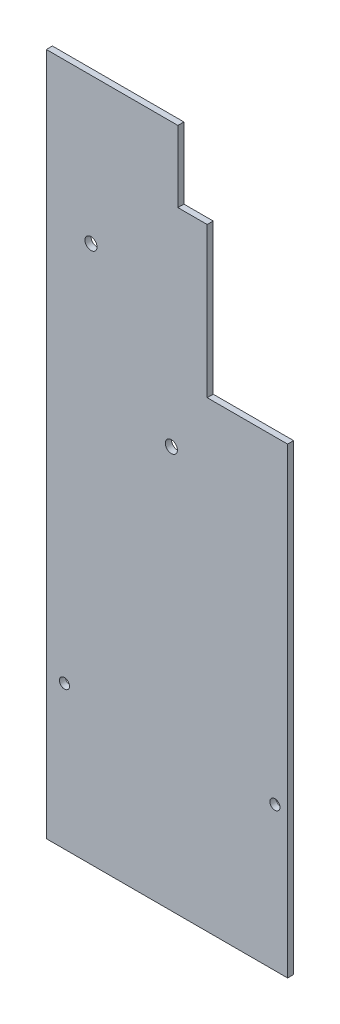
ISO-10303-21;
HEADER;
FILE_DESCRIPTION(('STEP AP214'),'2;1');
FILE_NAME('part.step','',(''),(''),'','','');
FILE_SCHEMA(('AUTOMOTIVE_DESIGN { 1 0 10303 214 1 1 1 1 }'));
ENDSEC;
DATA;
#1=APPLICATION_CONTEXT('core data for automotive mechanical design processes');
#2=APPLICATION_PROTOCOL_DEFINITION('international standard','automotive_design',2000,#1);
#3=PRODUCT_CONTEXT('',#1,'mechanical');
#4=PRODUCT('Part','Part','',(#3));
#5=PRODUCT_RELATED_PRODUCT_CATEGORY('part','',(#4));
#6=PRODUCT_DEFINITION_FORMATION('','',#4);
#7=PRODUCT_DEFINITION_CONTEXT('part definition',#1,'design');
#8=PRODUCT_DEFINITION('design','',#6,#7);
#9=PRODUCT_DEFINITION_SHAPE('','',#8);
#10=(LENGTH_UNIT() NAMED_UNIT(*) SI_UNIT(.MILLI.,.METRE.));
#11=(NAMED_UNIT(*) PLANE_ANGLE_UNIT() SI_UNIT($,.RADIAN.));
#12=(NAMED_UNIT(*) SI_UNIT($,.STERADIAN.) SOLID_ANGLE_UNIT());
#13=UNCERTAINTY_MEASURE_WITH_UNIT(LENGTH_MEASURE(1.E-05),#10,'distance_accuracy_value','');
#14=(GEOMETRIC_REPRESENTATION_CONTEXT(3) GLOBAL_UNCERTAINTY_ASSIGNED_CONTEXT((#13)) GLOBAL_UNIT_ASSIGNED_CONTEXT((#10,
#11,#12)) REPRESENTATION_CONTEXT('',''));
#15=CARTESIAN_POINT('',(0.,0.,0.));
#16=DIRECTION('',(0.,0.,1.));
#17=DIRECTION('',(1.,0.,0.));
#18=AXIS2_PLACEMENT_3D('',#15,#16,#17);
#19=CARTESIAN_POINT('',(20.0000000000001,-160.537558932388,23.901562241334));
#20=DIRECTION('',(-1.00000000000001,0.,0.));
#21=DIRECTION('',(0.,0.,1.00000000000001));
#22=AXIS2_PLACEMENT_3D('',#19,#20,#21);
#23=PLANE('',#22);
#24=DIRECTION('',(0.,-1.,0.));
#25=VECTOR('',#24,1.);
#26=CARTESIAN_POINT('',(20.0000000000001,-160.537558932388,25.401562241334));
#27=LINE('',#26,#25);
#28=CARTESIAN_POINT('',(20.0000000000001,-45.5375589323876,25.401562241334));
#29=VERTEX_POINT('',#28);
#30=CARTESIAN_POINT('',(20.0000000000001,-160.537558932388,25.401562241334));
#31=VERTEX_POINT('',#30);
#32=EDGE_CURVE('E125',#29,#31,#27,.T.);
#33=ORIENTED_EDGE('',*,*,#32,.T.);
#34=DIRECTION('',(0.,0.,1.00000000000001));
#35=VECTOR('',#34,1.);
#36=CARTESIAN_POINT('',(20.0000000000001,-160.537558932388,23.901562241334));
#37=LINE('',#36,#35);
#38=CARTESIAN_POINT('',(20.0000000000001,-160.537558932388,23.901562241334));
#39=VERTEX_POINT('',#38);
#40=EDGE_CURVE('E11',#39,#31,#37,.T.);
#41=ORIENTED_EDGE('',*,*,#40,.F.);
#42=DIRECTION('',(0.,-1.,0.));
#43=VECTOR('',#42,1.);
#44=CARTESIAN_POINT('',(20.0000000000001,-160.537558932388,23.901562241334));
#45=LINE('',#44,#43);
#46=CARTESIAN_POINT('',(20.0000000000003,-45.5375589323876,23.901562241334));
#47=VERTEX_POINT('',#46);
#48=EDGE_CURVE('E137',#47,#39,#45,.T.);
#49=ORIENTED_EDGE('',*,*,#48,.F.);
#50=DIRECTION('',(0.,0.,1.00000000000001));
#51=VECTOR('',#50,1.);
#52=CARTESIAN_POINT('',(20.0000000000003,-45.5375589323876,23.901562241334));
#53=LINE('',#52,#51);
#54=EDGE_CURVE('E124',#47,#29,#53,.T.);
#55=ORIENTED_EDGE('',*,*,#54,.T.);
#56=EDGE_LOOP('',(#33,#41,#49,#55));
#57=FACE_BOUND('',#56,.T.);
#58=ADVANCED_FACE('F32',(#57),#23,.F.);
#59=CARTESIAN_POINT('',(20.0000000000001,-160.537558932388,23.901562241334));
#60=DIRECTION('',(0.,1.,0.));
#61=DIRECTION('',(0.,0.,1.00000000000001));
#62=AXIS2_PLACEMENT_3D('',#59,#60,#61);
#63=PLANE('',#62);
#64=DIRECTION('',(-1.00000000000001,0.,0.));
#65=VECTOR('',#64,1.);
#66=CARTESIAN_POINT('',(20.0000000000001,-160.537558932388,25.401562241334));
#67=LINE('',#66,#65);
#68=CARTESIAN_POINT('',(-40.0000000000004,-160.537558932388,25.4015622413335));
#69=VERTEX_POINT('',#68);
#70=EDGE_CURVE('E128',#31,#69,#67,.T.);
#71=ORIENTED_EDGE('',*,*,#70,.T.);
#72=DIRECTION('',(0.,0.,1.00000000000001));
#73=VECTOR('',#72,1.);
#74=CARTESIAN_POINT('',(-40.0000000000003,-160.537558932388,23.9015622413335));
#75=LINE('',#74,#73);
#76=CARTESIAN_POINT('',(-40.0000000000003,-160.537558932388,23.9015622413335));
#77=VERTEX_POINT('',#76);
#78=EDGE_CURVE('E39',#77,#69,#75,.T.);
#79=ORIENTED_EDGE('',*,*,#78,.F.);
#80=DIRECTION('',(-1.00000000000001,0.,0.));
#81=VECTOR('',#80,1.);
#82=CARTESIAN_POINT('',(20.0000000000001,-160.537558932388,23.901562241334));
#83=LINE('',#82,#81);
#84=EDGE_CURVE('E87',#39,#77,#83,.T.);
#85=ORIENTED_EDGE('',*,*,#84,.F.);
#86=ORIENTED_EDGE('',*,*,#40,.T.);
#87=EDGE_LOOP('',(#71,#79,#85,#86));
#88=FACE_BOUND('',#87,.T.);
#89=ADVANCED_FACE('F183',(#88),#63,.F.);
#90=CARTESIAN_POINT('',(-40.0000000000003,-160.537558932388,23.9015622413335));
#91=DIRECTION('',(1.00000000000001,0.,0.));
#92=DIRECTION('',(0.,0.,-1.00000000000001));
#93=AXIS2_PLACEMENT_3D('',#90,#91,#92);
#94=PLANE('',#93);
#95=DIRECTION('',(0.,1.,0.));
#96=VECTOR('',#95,1.);
#97=CARTESIAN_POINT('',(-40.0000000000004,-160.537558932388,25.4015622413335));
#98=LINE('',#97,#96);
#99=CARTESIAN_POINT('',(-40.0000000000004,9.46244106761242,25.4015622413335));
#100=VERTEX_POINT('',#99);
#101=EDGE_CURVE('E109',#69,#100,#98,.T.);
#102=ORIENTED_EDGE('',*,*,#101,.T.);
#103=DIRECTION('',(0.,0.,1.00000000000001));
#104=VECTOR('',#103,1.);
#105=CARTESIAN_POINT('',(-40.0000000000003,9.46244106761242,23.9015622413335));
#106=LINE('',#105,#104);
#107=CARTESIAN_POINT('',(-40.0000000000003,9.46244106761242,23.9015622413335));
#108=VERTEX_POINT('',#107);
#109=EDGE_CURVE('E106',#108,#100,#106,.T.);
#110=ORIENTED_EDGE('',*,*,#109,.F.);
#111=DIRECTION('',(0.,1.,0.));
#112=VECTOR('',#111,1.);
#113=CARTESIAN_POINT('',(-40.0000000000003,-160.537558932388,23.9015622413335));
#114=LINE('',#113,#112);
#115=EDGE_CURVE('E94',#77,#108,#114,.T.);
#116=ORIENTED_EDGE('',*,*,#115,.F.);
#117=ORIENTED_EDGE('',*,*,#78,.T.);
#118=EDGE_LOOP('',(#102,#110,#116,#117));
#119=FACE_BOUND('',#118,.T.);
#120=ADVANCED_FACE('F107',(#119),#94,.F.);
#121=CARTESIAN_POINT('',(-40.0000000000003,9.46244106761242,23.9015622413335));
#122=DIRECTION('',(0.,-1.,0.));
#123=DIRECTION('',(1.00000000000001,0.,0.));
#124=AXIS2_PLACEMENT_3D('',#121,#122,#123);
#125=PLANE('',#124);
#126=DIRECTION('',(1.00000000000001,0.,0.));
#127=VECTOR('',#126,1.);
#128=CARTESIAN_POINT('',(-40.0000000000004,9.46244106761242,25.4015622413335));
#129=LINE('',#128,#127);
#130=CARTESIAN_POINT('',(-7.28976436130328,9.46244106761242,25.401562241334));
#131=VERTEX_POINT('',#130);
#132=EDGE_CURVE('E132',#100,#131,#129,.T.);
#133=ORIENTED_EDGE('',*,*,#132,.T.);
#134=DIRECTION('',(0.,0.,-1.00000000000001));
#135=VECTOR('',#134,1.);
#136=CARTESIAN_POINT('',(-7.28976436130328,9.46244106761242,25.402562241334));
#137=LINE('',#136,#135);
#138=CARTESIAN_POINT('',(-7.28976436130329,9.46244106761242,23.901562241334));
#139=VERTEX_POINT('',#138);
#140=EDGE_CURVE('E117',#131,#139,#137,.T.);
#141=ORIENTED_EDGE('',*,*,#140,.T.);
#142=DIRECTION('',(1.00000000000001,0.,0.));
#143=VECTOR('',#142,1.);
#144=CARTESIAN_POINT('',(-40.0000000000003,9.46244106761242,23.9015622413335));
#145=LINE('',#144,#143);
#146=EDGE_CURVE('E101',#108,#139,#145,.T.);
#147=ORIENTED_EDGE('',*,*,#146,.F.);
#148=ORIENTED_EDGE('',*,*,#109,.T.);
#149=EDGE_LOOP('',(#133,#141,#147,#148));
#150=FACE_BOUND('',#149,.T.);
#151=ADVANCED_FACE('F116',(#150),#125,.F.);
#152=CARTESIAN_POINT('',(0.,9.46244106761242,23.901562241334));
#153=DIRECTION('',(-1.00000000000001,0.,0.));
#154=DIRECTION('',(0.,-1.,0.));
#155=AXIS2_PLACEMENT_3D('',#152,#153,#154);
#156=PLANE('',#155);
#157=DIRECTION('',(0.,-1.,0.));
#158=VECTOR('',#157,1.);
#159=CARTESIAN_POINT('',(0.,9.46244106761242,23.901562241334));
#160=LINE('',#159,#158);
#161=CARTESIAN_POINT('',(0.,-8.23505770742372,23.901562241334));
#162=VERTEX_POINT('',#161);
#163=CARTESIAN_POINT('',(0.,-45.5375589323876,23.901562241334));
#164=VERTEX_POINT('',#163);
#165=EDGE_CURVE('E118',#162,#164,#160,.T.);
#166=ORIENTED_EDGE('',*,*,#165,.F.);
#167=DIRECTION('',(0.,0.,-1.00000000000001));
#168=VECTOR('',#167,1.);
#169=CARTESIAN_POINT('',(0.,-8.23505770742372,25.402562241334));
#170=LINE('',#169,#168);
#171=CARTESIAN_POINT('',(0.,-8.23505770742372,25.401562241334));
#172=VERTEX_POINT('',#171);
#173=EDGE_CURVE('E158',#172,#162,#170,.T.);
#174=ORIENTED_EDGE('',*,*,#173,.F.);
#175=DIRECTION('',(0.,-1.,0.));
#176=VECTOR('',#175,1.);
#177=CARTESIAN_POINT('',(0.,9.46244106761242,25.401562241334));
#178=LINE('',#177,#176);
#179=CARTESIAN_POINT('',(0.,-45.5375589323876,25.401562241334));
#180=VERTEX_POINT('',#179);
#181=EDGE_CURVE('E134',#172,#180,#178,.T.);
#182=ORIENTED_EDGE('',*,*,#181,.T.);
#183=DIRECTION('',(0.,0.,1.00000000000001));
#184=VECTOR('',#183,1.);
#185=CARTESIAN_POINT('',(0.,-45.5375589323876,23.901562241334));
#186=LINE('',#185,#184);
#187=EDGE_CURVE('E113',#164,#180,#186,.T.);
#188=ORIENTED_EDGE('',*,*,#187,.F.);
#189=EDGE_LOOP('',(#166,#174,#182,#188));
#190=FACE_BOUND('',#189,.T.);
#191=ADVANCED_FACE('F166',(#190),#156,.F.);
#192=CARTESIAN_POINT('',(0.,-45.5375589323876,23.901562241334));
#193=DIRECTION('',(0.,-1.,0.));
#194=DIRECTION('',(0.,0.,-1.00000000000001));
#195=AXIS2_PLACEMENT_3D('',#192,#193,#194);
#196=PLANE('',#195);
#197=DIRECTION('',(1.00000000000001,0.,0.));
#198=VECTOR('',#197,1.);
#199=CARTESIAN_POINT('',(0.,-45.5375589323876,25.401562241334));
#200=LINE('',#199,#198);
#201=EDGE_CURVE('E79',#180,#29,#200,.T.);
#202=ORIENTED_EDGE('',*,*,#201,.T.);
#203=ORIENTED_EDGE('',*,*,#54,.F.);
#204=DIRECTION('',(1.00000000000001,0.,0.));
#205=VECTOR('',#204,1.);
#206=CARTESIAN_POINT('',(0.,-45.5375589323876,23.901562241334));
#207=LINE('',#206,#205);
#208=EDGE_CURVE('E55',#164,#47,#207,.T.);
#209=ORIENTED_EDGE('',*,*,#208,.F.);
#210=ORIENTED_EDGE('',*,*,#187,.T.);
#211=EDGE_LOOP('',(#202,#203,#209,#210));
#212=FACE_BOUND('',#211,.T.);
#213=ADVANCED_FACE('F172',(#212),#196,.F.);
#214=CARTESIAN_POINT('',(20.0000000000003,-45.5375589323876,23.901562241334));
#215=DIRECTION('',(0.,0.,-1.00000000000001));
#216=DIRECTION('',(-1.00000000000001,0.,0.));
#217=AXIS2_PLACEMENT_3D('',#214,#215,#216);
#218=PLANE('',#217);
#219=DIRECTION('',(0.,1.,0.));
#220=VECTOR('',#219,1.);
#221=CARTESIAN_POINT('',(-7.28976436130331,-8.23505770742372,23.901562241334));
#222=LINE('',#221,#220);
#223=CARTESIAN_POINT('',(-7.28976436130331,-8.23505770742372,23.901562241334));
#224=VERTEX_POINT('',#223);
#225=EDGE_CURVE('E145',#224,#139,#222,.T.);
#226=ORIENTED_EDGE('',*,*,#225,.F.);
#227=DIRECTION('',(-1.00000000000001,0.,0.));
#228=VECTOR('',#227,1.);
#229=CARTESIAN_POINT('',(0.,-8.23505770742372,23.901562241334));
#230=LINE('',#229,#228);
#231=EDGE_CURVE('E325',#162,#224,#230,.T.);
#232=ORIENTED_EDGE('',*,*,#231,.F.);
#233=ORIENTED_EDGE('',*,*,#165,.T.);
#234=ORIENTED_EDGE('',*,*,#208,.T.);
#235=ORIENTED_EDGE('',*,*,#48,.T.);
#236=ORIENTED_EDGE('',*,*,#84,.T.);
#237=ORIENTED_EDGE('',*,*,#115,.T.);
#238=ORIENTED_EDGE('',*,*,#146,.T.);
#239=EDGE_LOOP('',(#226,#232,#233,#234,#235,#236,#237,#238));
#240=FACE_BOUND('',#239,.T.);
#241=CARTESIAN_POINT('',(-8.90000000000007,-60.5375589323876,23.901562241334));
#242=DIRECTION('',(0.,0.,-1.00000000000001));
#243=DIRECTION('',(-1.00000000000001,0.,0.));
#244=AXIS2_PLACEMENT_3D('',#241,#242,#243);
#245=CIRCLE('',#244,1.5);
#246=CARTESIAN_POINT('',(-10.4000000000001,-60.5375589323876,23.901562241334));
#247=VERTEX_POINT('',#246);
#248=EDGE_CURVE('E162',#247,#247,#245,.T.);
#249=ORIENTED_EDGE('',*,*,#248,.F.);
#250=EDGE_LOOP('',(#249));
#251=FACE_BOUND('',#250,.T.);
#252=CARTESIAN_POINT('',(16.8491697093726,-124.73468268338,23.901562241334));
#253=DIRECTION('',(0.,0.,-1.00000000000001));
#254=DIRECTION('',(-1.00000000000001,0.,0.));
#255=AXIS2_PLACEMENT_3D('',#252,#253,#254);
#256=CIRCLE('',#255,1.24999999999999);
#257=CARTESIAN_POINT('',(15.5991697093726,-124.73468268338,23.901562241334));
#258=VERTEX_POINT('',#257);
#259=EDGE_CURVE('E286',#258,#258,#256,.T.);
#260=ORIENTED_EDGE('',*,*,#259,.F.);
#261=EDGE_LOOP('',(#260));
#262=FACE_BOUND('',#261,.T.);
#263=CARTESIAN_POINT('',(-35.5000000000004,-124.808922584317,23.901562241334));
#264=DIRECTION('',(0.,0.,-1.00000000000001));
#265=DIRECTION('',(-1.00000000000001,0.,0.));
#266=AXIS2_PLACEMENT_3D('',#263,#264,#265);
#267=CIRCLE('',#266,1.24999999999999);
#268=CARTESIAN_POINT('',(-36.7500000000004,-124.808922584317,23.901562241334));
#269=VERTEX_POINT('',#268);
#270=EDGE_CURVE('E295',#269,#269,#267,.T.);
#271=ORIENTED_EDGE('',*,*,#270,.F.);
#272=EDGE_LOOP('',(#271));
#273=FACE_BOUND('',#272,.T.);
#274=CARTESIAN_POINT('',(-28.9000000000003,-26.7875589323876,23.901562241334));
#275=DIRECTION('',(0.,0.,-1.00000000000001));
#276=DIRECTION('',(-1.00000000000001,0.,0.));
#277=AXIS2_PLACEMENT_3D('',#274,#275,#276);
#278=CIRCLE('',#277,1.5);
#279=CARTESIAN_POINT('',(-30.4000000000003,-26.7875589323876,23.901562241334));
#280=VERTEX_POINT('',#279);
#281=EDGE_CURVE('E301',#280,#280,#278,.T.);
#282=ORIENTED_EDGE('',*,*,#281,.F.);
#283=EDGE_LOOP('',(#282));
#284=FACE_BOUND('',#283,.T.);
#285=ADVANCED_FACE('F97',(#240,#251,#262,#273,#284),#218,.T.);
#286=CARTESIAN_POINT('',(20.0000000000001,-45.5375589323876,25.401562241334));
#287=DIRECTION('',(0.,0.,-1.00000000000001));
#288=DIRECTION('',(-1.00000000000001,0.,0.));
#289=AXIS2_PLACEMENT_3D('',#286,#287,#288);
#290=PLANE('',#289);
#291=CARTESIAN_POINT('',(-8.90000000000007,-60.5375589323876,25.401562241334));
#292=DIRECTION('',(0.,0.,-1.00000000000001));
#293=DIRECTION('',(-1.00000000000001,0.,0.));
#294=AXIS2_PLACEMENT_3D('',#291,#292,#293);
#295=CIRCLE('',#294,1.5);
#296=CARTESIAN_POINT('',(-10.4000000000001,-60.5375589323876,25.401562241334));
#297=VERTEX_POINT('',#296);
#298=EDGE_CURVE('E285',#297,#297,#295,.F.);
#299=ORIENTED_EDGE('',*,*,#298,.F.);
#300=EDGE_LOOP('',(#299));
#301=FACE_BOUND('',#300,.T.);
#302=CARTESIAN_POINT('',(16.8491697093726,-124.73468268338,25.401562241334));
#303=DIRECTION('',(0.,0.,-1.00000000000001));
#304=DIRECTION('',(-1.00000000000001,0.,0.));
#305=AXIS2_PLACEMENT_3D('',#302,#303,#304);
#306=CIRCLE('',#305,1.24999999999999);
#307=CARTESIAN_POINT('',(15.5991697093726,-124.73468268338,25.401562241334));
#308=VERTEX_POINT('',#307);
#309=EDGE_CURVE('E289',#308,#308,#306,.T.);
#310=ORIENTED_EDGE('',*,*,#309,.T.);
#311=EDGE_LOOP('',(#310));
#312=FACE_BOUND('',#311,.T.);
#313=CARTESIAN_POINT('',(-35.5000000000003,-124.808922584317,25.401562241334));
#314=DIRECTION('',(0.,0.,-1.00000000000001));
#315=DIRECTION('',(-1.00000000000001,0.,0.));
#316=AXIS2_PLACEMENT_3D('',#313,#314,#315);
#317=CIRCLE('',#316,1.24999999999999);
#318=CARTESIAN_POINT('',(-36.7500000000003,-124.808922584317,25.401562241334));
#319=VERTEX_POINT('',#318);
#320=EDGE_CURVE('E298',#319,#319,#317,.T.);
#321=ORIENTED_EDGE('',*,*,#320,.T.);
#322=EDGE_LOOP('',(#321));
#323=FACE_BOUND('',#322,.T.);
#324=CARTESIAN_POINT('',(-28.9000000000003,-26.7875589323876,25.401562241334));
#325=DIRECTION('',(0.,0.,-1.00000000000001));
#326=DIRECTION('',(-1.00000000000001,0.,0.));
#327=AXIS2_PLACEMENT_3D('',#324,#325,#326);
#328=CIRCLE('',#327,1.5);
#329=CARTESIAN_POINT('',(-30.4000000000003,-26.7875589323876,25.401562241334));
#330=VERTEX_POINT('',#329);
#331=EDGE_CURVE('E129',#330,#330,#328,.F.);
#332=ORIENTED_EDGE('',*,*,#331,.F.);
#333=EDGE_LOOP('',(#332));
#334=FACE_BOUND('',#333,.T.);
#335=DIRECTION('',(1.00000000000001,0.,0.));
#336=VECTOR('',#335,1.);
#337=CARTESIAN_POINT('',(0.,-8.23505770742372,25.401562241334));
#338=LINE('',#337,#336);
#339=CARTESIAN_POINT('',(-7.28976436130329,-8.23505770742372,25.401562241334));
#340=VERTEX_POINT('',#339);
#341=EDGE_CURVE('E154',#340,#172,#338,.T.);
#342=ORIENTED_EDGE('',*,*,#341,.F.);
#343=DIRECTION('',(0.,-1.,0.));
#344=VECTOR('',#343,1.);
#345=CARTESIAN_POINT('',(-7.28976436130329,-8.23505770742372,25.401562241334));
#346=LINE('',#345,#344);
#347=EDGE_CURVE('E46',#131,#340,#346,.T.);
#348=ORIENTED_EDGE('',*,*,#347,.F.);
#349=ORIENTED_EDGE('',*,*,#132,.F.);
#350=ORIENTED_EDGE('',*,*,#101,.F.);
#351=ORIENTED_EDGE('',*,*,#70,.F.);
#352=ORIENTED_EDGE('',*,*,#32,.F.);
#353=ORIENTED_EDGE('',*,*,#201,.F.);
#354=ORIENTED_EDGE('',*,*,#181,.F.);
#355=EDGE_LOOP('',(#342,#348,#349,#350,#351,#352,#353,#354));
#356=FACE_BOUND('',#355,.T.);
#357=ADVANCED_FACE('F141',(#301,#312,#323,#334,#356),#290,.F.);
#358=CARTESIAN_POINT('',(-28.9000000000003,-26.7875589323876,25.402562241334));
#359=DIRECTION('',(0.,0.,-1.00000000000001));
#360=DIRECTION('',(-1.00000000000001,0.,0.));
#361=AXIS2_PLACEMENT_3D('',#358,#359,#360);
#362=CYLINDRICAL_SURFACE('',#361,1.5);
#363=ORIENTED_EDGE('',*,*,#281,.T.);
#364=EDGE_LOOP('',(#363));
#365=FACE_BOUND('',#364,.T.);
#366=ORIENTED_EDGE('',*,*,#331,.T.);
#367=EDGE_LOOP('',(#366));
#368=FACE_BOUND('',#367,.T.);
#369=ADVANCED_FACE('F220',(#365,#368),#362,.F.);
#370=CARTESIAN_POINT('',(-35.5000000000004,-124.808922584317,23.901562241334));
#371=DIRECTION('',(0.,0.,-1.00000000000001));
#372=DIRECTION('',(-1.00000000000001,0.,0.));
#373=AXIS2_PLACEMENT_3D('',#370,#371,#372);
#374=CYLINDRICAL_SURFACE('',#373,1.24999999999999);
#375=ORIENTED_EDGE('',*,*,#320,.F.);
#376=EDGE_LOOP('',(#375));
#377=FACE_BOUND('',#376,.T.);
#378=ORIENTED_EDGE('',*,*,#270,.T.);
#379=EDGE_LOOP('',(#378));
#380=FACE_BOUND('',#379,.T.);
#381=ADVANCED_FACE('F229',(#377,#380),#374,.F.);
#382=CARTESIAN_POINT('',(16.8491697093726,-124.73468268338,23.901562241334));
#383=DIRECTION('',(0.,0.,-1.00000000000001));
#384=DIRECTION('',(-1.00000000000001,0.,0.));
#385=AXIS2_PLACEMENT_3D('',#382,#383,#384);
#386=CYLINDRICAL_SURFACE('',#385,1.24999999999999);
#387=ORIENTED_EDGE('',*,*,#309,.F.);
#388=EDGE_LOOP('',(#387));
#389=FACE_BOUND('',#388,.T.);
#390=ORIENTED_EDGE('',*,*,#259,.T.);
#391=EDGE_LOOP('',(#390));
#392=FACE_BOUND('',#391,.T.);
#393=ADVANCED_FACE('F239',(#389,#392),#386,.F.);
#394=CARTESIAN_POINT('',(-8.90000000000007,-60.5375589323876,25.402562241334));
#395=DIRECTION('',(0.,0.,-1.00000000000001));
#396=DIRECTION('',(-1.00000000000001,0.,0.));
#397=AXIS2_PLACEMENT_3D('',#394,#395,#396);
#398=CYLINDRICAL_SURFACE('',#397,1.5);
#399=ORIENTED_EDGE('',*,*,#248,.T.);
#400=EDGE_LOOP('',(#399));
#401=FACE_BOUND('',#400,.T.);
#402=ORIENTED_EDGE('',*,*,#298,.T.);
#403=EDGE_LOOP('',(#402));
#404=FACE_BOUND('',#403,.T.);
#405=ADVANCED_FACE('F249',(#401,#404),#398,.F.);
#406=CARTESIAN_POINT('',(-7.28976436130329,-8.23505770742372,25.402562241334));
#407=DIRECTION('',(-1.00000000000001,0.,0.));
#408=DIRECTION('',(0.,0.,1.00000000000001));
#409=AXIS2_PLACEMENT_3D('',#406,#407,#408);
#410=PLANE('',#409);
#411=ORIENTED_EDGE('',*,*,#347,.T.);
#412=DIRECTION('',(0.,0.,-1.00000000000001));
#413=VECTOR('',#412,1.);
#414=CARTESIAN_POINT('',(-7.28976436130329,-8.23505770742372,25.402562241334));
#415=LINE('',#414,#413);
#416=EDGE_CURVE('E160',#340,#224,#415,.T.);
#417=ORIENTED_EDGE('',*,*,#416,.T.);
#418=ORIENTED_EDGE('',*,*,#225,.T.);
#419=ORIENTED_EDGE('',*,*,#140,.F.);
#420=EDGE_LOOP('',(#411,#417,#418,#419));
#421=FACE_BOUND('',#420,.T.);
#422=ADVANCED_FACE('F259',(#421),#410,.F.);
#423=CARTESIAN_POINT('',(0.,-8.23505770742372,25.402562241334));
#424=DIRECTION('',(0.,-1.,0.));
#425=DIRECTION('',(0.,0.,-1.00000000000001));
#426=AXIS2_PLACEMENT_3D('',#423,#424,#425);
#427=PLANE('',#426);
#428=ORIENTED_EDGE('',*,*,#341,.T.);
#429=ORIENTED_EDGE('',*,*,#173,.T.);
#430=ORIENTED_EDGE('',*,*,#231,.T.);
#431=ORIENTED_EDGE('',*,*,#416,.F.);
#432=EDGE_LOOP('',(#428,#429,#430,#431));
#433=FACE_BOUND('',#432,.T.);
#434=ADVANCED_FACE('F156',(#433),#427,.F.);
#435=CLOSED_SHELL('',(#58,#89,#120,#151,#191,#213,#285,#357,#369,#381,#393,#405,#422,#434));
#436=MANIFOLD_SOLID_BREP('B2',#435);
#437=ADVANCED_BREP_SHAPE_REPRESENTATION('',(#18,#436),#14);
#438=SHAPE_DEFINITION_REPRESENTATION(#9,#437);
ENDSEC;
END-ISO-10303-21;
